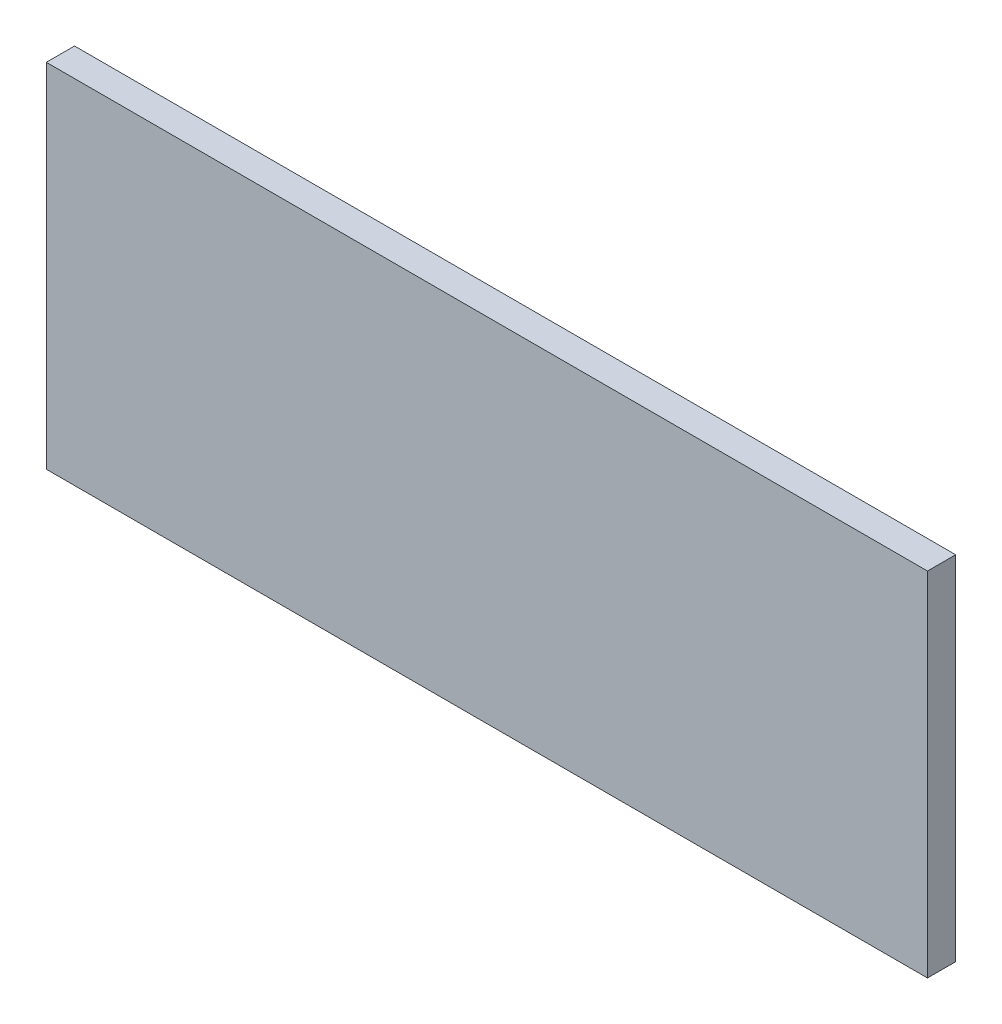
ISO-10303-21;
HEADER;
FILE_DESCRIPTION(('STEP AP214'),'2;1');
FILE_NAME('part.step','',(''),(''),'','','');
FILE_SCHEMA(('AUTOMOTIVE_DESIGN { 1 0 10303 214 1 1 1 1 }'));
ENDSEC;
DATA;
#1=APPLICATION_CONTEXT('core data for automotive mechanical design processes');
#2=APPLICATION_PROTOCOL_DEFINITION('international standard','automotive_design',2000,#1);
#3=PRODUCT_CONTEXT('',#1,'mechanical');
#4=PRODUCT('Part','Part','',(#3));
#5=PRODUCT_RELATED_PRODUCT_CATEGORY('part','',(#4));
#6=PRODUCT_DEFINITION_FORMATION('','',#4);
#7=PRODUCT_DEFINITION_CONTEXT('part definition',#1,'design');
#8=PRODUCT_DEFINITION('design','',#6,#7);
#9=PRODUCT_DEFINITION_SHAPE('','',#8);
#10=(LENGTH_UNIT() NAMED_UNIT(*) SI_UNIT(.MILLI.,.METRE.));
#11=(NAMED_UNIT(*) PLANE_ANGLE_UNIT() SI_UNIT($,.RADIAN.));
#12=(NAMED_UNIT(*) SI_UNIT($,.STERADIAN.) SOLID_ANGLE_UNIT());
#13=UNCERTAINTY_MEASURE_WITH_UNIT(LENGTH_MEASURE(1.E-05),#10,'distance_accuracy_value','');
#14=(GEOMETRIC_REPRESENTATION_CONTEXT(3) GLOBAL_UNCERTAINTY_ASSIGNED_CONTEXT((#13)) GLOBAL_UNIT_ASSIGNED_CONTEXT((#10,
#11,#12)) REPRESENTATION_CONTEXT('',''));
#15=CARTESIAN_POINT('',(0.,0.,0.));
#16=DIRECTION('',(0.,0.,1.));
#17=DIRECTION('',(1.,0.,0.));
#18=AXIS2_PLACEMENT_3D('',#15,#16,#17);
#19=CARTESIAN_POINT('',(125.,100.,8.));
#20=DIRECTION('',(-1.,0.,0.));
#21=DIRECTION('',(0.,0.,1.));
#22=AXIS2_PLACEMENT_3D('',#19,#20,#21);
#23=PLANE('',#22);
#24=DIRECTION('',(0.,1.,0.));
#25=VECTOR('',#24,1.);
#26=CARTESIAN_POINT('',(125.,100.,0.));
#27=LINE('',#26,#25);
#28=CARTESIAN_POINT('',(125.,0.,0.));
#29=VERTEX_POINT('',#28);
#30=CARTESIAN_POINT('',(125.,100.,0.));
#31=VERTEX_POINT('',#30);
#32=EDGE_CURVE('E111',#29,#31,#27,.T.);
#33=ORIENTED_EDGE('',*,*,#32,.T.);
#34=DIRECTION('',(0.,0.,-1.));
#35=VECTOR('',#34,1.);
#36=CARTESIAN_POINT('',(125.,100.,8.));
#37=LINE('',#36,#35);
#38=CARTESIAN_POINT('',(125.,100.,8.));
#39=VERTEX_POINT('',#38);
#40=EDGE_CURVE('E11',#39,#31,#37,.T.);
#41=ORIENTED_EDGE('',*,*,#40,.F.);
#42=DIRECTION('',(0.,1.,0.));
#43=VECTOR('',#42,1.);
#44=CARTESIAN_POINT('',(125.,100.,8.));
#45=LINE('',#44,#43);
#46=CARTESIAN_POINT('',(125.,0.,8.));
#47=VERTEX_POINT('',#46);
#48=EDGE_CURVE('E95',#47,#39,#45,.T.);
#49=ORIENTED_EDGE('',*,*,#48,.F.);
#50=DIRECTION('',(0.,0.,-1.));
#51=VECTOR('',#50,1.);
#52=CARTESIAN_POINT('',(125.,0.,8.));
#53=LINE('',#52,#51);
#54=EDGE_CURVE('E107',#47,#29,#53,.T.);
#55=ORIENTED_EDGE('',*,*,#54,.T.);
#56=EDGE_LOOP('',(#33,#41,#49,#55));
#57=FACE_BOUND('',#56,.T.);
#58=ADVANCED_FACE('F43',(#57),#23,.F.);
#59=CARTESIAN_POINT('',(-125.,100.,8.));
#60=DIRECTION('',(0.,-1.,0.));
#61=DIRECTION('',(0.,0.,-1.));
#62=AXIS2_PLACEMENT_3D('',#59,#60,#61);
#63=PLANE('',#62);
#64=DIRECTION('',(-1.,0.,0.));
#65=VECTOR('',#64,1.);
#66=CARTESIAN_POINT('',(-125.,100.,0.));
#67=LINE('',#66,#65);
#68=CARTESIAN_POINT('',(-125.,100.,0.));
#69=VERTEX_POINT('',#68);
#70=EDGE_CURVE('E100',#31,#69,#67,.T.);
#71=ORIENTED_EDGE('',*,*,#70,.T.);
#72=DIRECTION('',(0.,0.,-1.));
#73=VECTOR('',#72,1.);
#74=CARTESIAN_POINT('',(-125.,100.,8.));
#75=LINE('',#74,#73);
#76=CARTESIAN_POINT('',(-125.,100.,8.));
#77=VERTEX_POINT('',#76);
#78=EDGE_CURVE('E52',#77,#69,#75,.T.);
#79=ORIENTED_EDGE('',*,*,#78,.F.);
#80=DIRECTION('',(-1.,0.,0.));
#81=VECTOR('',#80,1.);
#82=CARTESIAN_POINT('',(-125.,100.,8.));
#83=LINE('',#82,#81);
#84=EDGE_CURVE('E90',#39,#77,#83,.T.);
#85=ORIENTED_EDGE('',*,*,#84,.F.);
#86=ORIENTED_EDGE('',*,*,#40,.T.);
#87=EDGE_LOOP('',(#71,#79,#85,#86));
#88=FACE_BOUND('',#87,.T.);
#89=ADVANCED_FACE('F99',(#88),#63,.F.);
#90=CARTESIAN_POINT('',(-125.,100.,8.));
#91=DIRECTION('',(1.,0.,0.));
#92=DIRECTION('',(0.,1.,0.));
#93=AXIS2_PLACEMENT_3D('',#90,#91,#92);
#94=PLANE('',#93);
#95=DIRECTION('',(0.,-1.,0.));
#96=VECTOR('',#95,1.);
#97=CARTESIAN_POINT('',(-125.,100.,0.));
#98=LINE('',#97,#96);
#99=CARTESIAN_POINT('',(-125.,0.,0.));
#100=VERTEX_POINT('',#99);
#101=EDGE_CURVE('E77',#69,#100,#98,.T.);
#102=ORIENTED_EDGE('',*,*,#101,.T.);
#103=DIRECTION('',(0.,0.,-1.));
#104=VECTOR('',#103,1.);
#105=CARTESIAN_POINT('',(-125.,0.,8.));
#106=LINE('',#105,#104);
#107=CARTESIAN_POINT('',(-125.,0.,8.));
#108=VERTEX_POINT('',#107);
#109=EDGE_CURVE('E102',#108,#100,#106,.T.);
#110=ORIENTED_EDGE('',*,*,#109,.F.);
#111=DIRECTION('',(0.,-1.,0.));
#112=VECTOR('',#111,1.);
#113=CARTESIAN_POINT('',(-125.,100.,8.));
#114=LINE('',#113,#112);
#115=EDGE_CURVE('E93',#77,#108,#114,.T.);
#116=ORIENTED_EDGE('',*,*,#115,.F.);
#117=ORIENTED_EDGE('',*,*,#78,.T.);
#118=EDGE_LOOP('',(#102,#110,#116,#117));
#119=FACE_BOUND('',#118,.T.);
#120=ADVANCED_FACE('F103',(#119),#94,.F.);
#121=CARTESIAN_POINT('',(-125.,0.,8.));
#122=DIRECTION('',(0.,1.,0.));
#123=DIRECTION('',(0.,0.,1.));
#124=AXIS2_PLACEMENT_3D('',#121,#122,#123);
#125=PLANE('',#124);
#126=DIRECTION('',(1.,0.,0.));
#127=VECTOR('',#126,1.);
#128=CARTESIAN_POINT('',(-125.,0.,0.));
#129=LINE('',#128,#127);
#130=EDGE_CURVE('E83',#100,#29,#129,.T.);
#131=ORIENTED_EDGE('',*,*,#130,.T.);
#132=ORIENTED_EDGE('',*,*,#54,.F.);
#133=DIRECTION('',(1.,0.,0.));
#134=VECTOR('',#133,1.);
#135=CARTESIAN_POINT('',(-125.,0.,8.));
#136=LINE('',#135,#134);
#137=EDGE_CURVE('E60',#108,#47,#136,.T.);
#138=ORIENTED_EDGE('',*,*,#137,.F.);
#139=ORIENTED_EDGE('',*,*,#109,.T.);
#140=EDGE_LOOP('',(#131,#132,#138,#139));
#141=FACE_BOUND('',#140,.T.);
#142=ADVANCED_FACE('F124',(#141),#125,.F.);
#143=CARTESIAN_POINT('',(0.,0.,8.));
#144=DIRECTION('',(0.,0.,1.));
#145=DIRECTION('',(1.,0.,0.));
#146=AXIS2_PLACEMENT_3D('',#143,#144,#145);
#147=PLANE('',#146);
#148=ORIENTED_EDGE('',*,*,#48,.T.);
#149=ORIENTED_EDGE('',*,*,#84,.T.);
#150=ORIENTED_EDGE('',*,*,#115,.T.);
#151=ORIENTED_EDGE('',*,*,#137,.T.);
#152=EDGE_LOOP('',(#148,#149,#150,#151));
#153=FACE_BOUND('',#152,.T.);
#154=ADVANCED_FACE('F91',(#153),#147,.T.);
#155=CARTESIAN_POINT('',(0.,0.,0.));
#156=DIRECTION('',(0.,0.,1.));
#157=DIRECTION('',(1.,0.,0.));
#158=AXIS2_PLACEMENT_3D('',#155,#156,#157);
#159=PLANE('',#158);
#160=ORIENTED_EDGE('',*,*,#32,.F.);
#161=ORIENTED_EDGE('',*,*,#130,.F.);
#162=ORIENTED_EDGE('',*,*,#101,.F.);
#163=ORIENTED_EDGE('',*,*,#70,.F.);
#164=EDGE_LOOP('',(#160,#161,#162,#163));
#165=FACE_BOUND('',#164,.T.);
#166=ADVANCED_FACE('F127',(#165),#159,.F.);
#167=CLOSED_SHELL('',(#58,#89,#120,#142,#154,#166));
#168=MANIFOLD_SOLID_BREP('B2',#167);
#169=ADVANCED_BREP_SHAPE_REPRESENTATION('',(#18,#168),#14);
#170=SHAPE_DEFINITION_REPRESENTATION(#9,#169);
ENDSEC;
END-ISO-10303-21;
